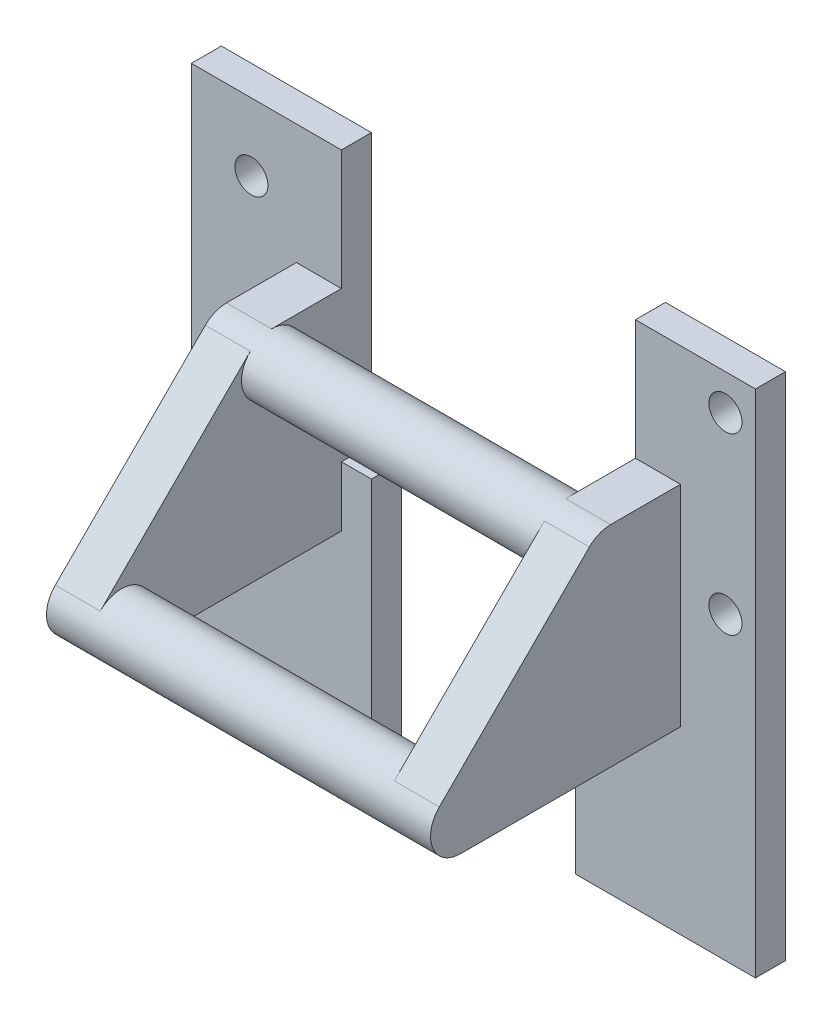
ISO-10303-21;
HEADER;
FILE_DESCRIPTION(('STEP AP214'),'2;1');
FILE_NAME('part.step','',(''),(''),'','','');
FILE_SCHEMA(('AUTOMOTIVE_DESIGN { 1 0 10303 214 1 1 1 1 }'));
ENDSEC;
DATA;
#1=APPLICATION_CONTEXT('core data for automotive mechanical design processes');
#2=APPLICATION_PROTOCOL_DEFINITION('international standard','automotive_design',2000,#1);
#3=PRODUCT_CONTEXT('',#1,'mechanical');
#4=PRODUCT('Part','Part','',(#3));
#5=PRODUCT_RELATED_PRODUCT_CATEGORY('part','',(#4));
#6=PRODUCT_DEFINITION_FORMATION('','',#4);
#7=PRODUCT_DEFINITION_CONTEXT('part definition',#1,'design');
#8=PRODUCT_DEFINITION('design','',#6,#7);
#9=PRODUCT_DEFINITION_SHAPE('','',#8);
#10=(LENGTH_UNIT() NAMED_UNIT(*) SI_UNIT(.MILLI.,.METRE.));
#11=(NAMED_UNIT(*) PLANE_ANGLE_UNIT() SI_UNIT($,.RADIAN.));
#12=(NAMED_UNIT(*) SI_UNIT($,.STERADIAN.) SOLID_ANGLE_UNIT());
#13=UNCERTAINTY_MEASURE_WITH_UNIT(LENGTH_MEASURE(1.E-05),#10,'distance_accuracy_value','');
#14=(GEOMETRIC_REPRESENTATION_CONTEXT(3) GLOBAL_UNCERTAINTY_ASSIGNED_CONTEXT((#13)) GLOBAL_UNIT_ASSIGNED_CONTEXT((#10,
#11,#12)) REPRESENTATION_CONTEXT('',''));
#15=CARTESIAN_POINT('',(0.,0.,0.));
#16=DIRECTION('',(0.,0.,1.));
#17=DIRECTION('',(1.,0.,0.));
#18=AXIS2_PLACEMENT_3D('',#15,#16,#17);
#19=CARTESIAN_POINT('',(0.,0.,5.));
#20=DIRECTION('',(0.,0.,1.));
#21=DIRECTION('',(1.,0.,0.));
#22=AXIS2_PLACEMENT_3D('',#19,#20,#21);
#23=PLANE('',#22);
#24=CARTESIAN_POINT('',(-64.,-65.,5.));
#25=DIRECTION('',(0.,0.,1.));
#26=DIRECTION('',(1.,0.,0.));
#27=AXIS2_PLACEMENT_3D('',#24,#25,#26);
#28=CIRCLE('',#27,2.75);
#29=CARTESIAN_POINT('',(-61.25,-65.,5.));
#30=VERTEX_POINT('',#29);
#31=EDGE_CURVE('E367',#30,#30,#28,.T.);
#32=ORIENTED_EDGE('',*,*,#31,.F.);
#33=EDGE_LOOP('',(#32));
#34=FACE_BOUND('',#33,.T.);
#35=CARTESIAN_POINT('',(-64.,-41.25,5.));
#36=DIRECTION('',(0.,0.,1.));
#37=DIRECTION('',(1.,0.,0.));
#38=AXIS2_PLACEMENT_3D('',#35,#36,#37);
#39=CIRCLE('',#38,2.75);
#40=CARTESIAN_POINT('',(-61.25,-41.25,5.));
#41=VERTEX_POINT('',#40);
#42=EDGE_CURVE('E361',#41,#41,#39,.T.);
#43=ORIENTED_EDGE('',*,*,#42,.F.);
#44=EDGE_LOOP('',(#43));
#45=FACE_BOUND('',#44,.T.);
#46=DIRECTION('',(0.,1.,0.));
#47=VECTOR('',#46,1.);
#48=CARTESIAN_POINT('',(-49.,-85.0000000000001,5.));
#49=LINE('',#48,#47);
#50=CARTESIAN_POINT('',(-49.,-85.0000000000001,5.));
#51=VERTEX_POINT('',#50);
#52=CARTESIAN_POINT('',(-49.,-75.,5.));
#53=VERTEX_POINT('',#52);
#54=EDGE_CURVE('E341',#51,#53,#49,.T.);
#55=ORIENTED_EDGE('',*,*,#54,.F.);
#56=DIRECTION('',(1.,0.,0.));
#57=VECTOR('',#56,1.);
#58=CARTESIAN_POINT('',(-56.5,-85.0000000000001,5.));
#59=LINE('',#58,#57);
#60=CARTESIAN_POINT('',(-56.5,-85.0000000000001,5.));
#61=VERTEX_POINT('',#60);
#62=EDGE_CURVE('E355',#61,#51,#59,.T.);
#63=ORIENTED_EDGE('',*,*,#62,.F.);
#64=DIRECTION('',(0.,1.,0.));
#65=VECTOR('',#64,1.);
#66=CARTESIAN_POINT('',(-56.5,0.,4.99999999999999));
#67=LINE('',#66,#65);
#68=CARTESIAN_POINT('',(-56.5,-50.,5.));
#69=VERTEX_POINT('',#68);
#70=EDGE_CURVE('E347',#61,#69,#67,.T.);
#71=ORIENTED_EDGE('',*,*,#70,.T.);
#72=DIRECTION('',(1.,0.,0.));
#73=VECTOR('',#72,1.);
#74=CARTESIAN_POINT('',(-56.5,-50.,5.));
#75=LINE('',#74,#73);
#76=CARTESIAN_POINT('',(-49.,-50.,5.));
#77=VERTEX_POINT('',#76);
#78=EDGE_CURVE('E356',#69,#77,#75,.T.);
#79=ORIENTED_EDGE('',*,*,#78,.T.);
#80=DIRECTION('',(0.,-1.,0.));
#81=VECTOR('',#80,1.);
#82=CARTESIAN_POINT('',(-49.,-30.,5.));
#83=LINE('',#82,#81);
#84=CARTESIAN_POINT('',(-49.,-30.,5.));
#85=VERTEX_POINT('',#84);
#86=EDGE_CURVE('E331',#85,#77,#83,.T.);
#87=ORIENTED_EDGE('',*,*,#86,.F.);
#88=DIRECTION('',(-1.,0.,0.));
#89=VECTOR('',#88,1.);
#90=CARTESIAN_POINT('',(-54.,-30.,5.));
#91=LINE('',#90,#89);
#92=CARTESIAN_POINT('',(-74.,-30.,5.));
#93=VERTEX_POINT('',#92);
#94=EDGE_CURVE('E373',#85,#93,#91,.T.);
#95=ORIENTED_EDGE('',*,*,#94,.T.);
#96=DIRECTION('',(0.,-1.,0.));
#97=VECTOR('',#96,1.);
#98=CARTESIAN_POINT('',(-74.,-30.,5.));
#99=LINE('',#98,#97);
#100=CARTESIAN_POINT('',(-74.0000000000001,-115.,5.));
#101=VERTEX_POINT('',#100);
#102=EDGE_CURVE('E376',#93,#101,#99,.T.);
#103=ORIENTED_EDGE('',*,*,#102,.T.);
#104=DIRECTION('',(1.,0.,0.));
#105=VECTOR('',#104,1.);
#106=CARTESIAN_POINT('',(-74.0000000000001,-115.,5.));
#107=LINE('',#106,#105);
#108=CARTESIAN_POINT('',(-44.,-115.,5.));
#109=VERTEX_POINT('',#108);
#110=EDGE_CURVE('E379',#101,#109,#107,.T.);
#111=ORIENTED_EDGE('',*,*,#110,.T.);
#112=DIRECTION('',(0.,1.,0.));
#113=VECTOR('',#112,1.);
#114=CARTESIAN_POINT('',(-44.,-115.,5.));
#115=LINE('',#114,#113);
#116=CARTESIAN_POINT('',(-44.,-75.,5.));
#117=VERTEX_POINT('',#116);
#118=EDGE_CURVE('E381',#109,#117,#115,.T.);
#119=ORIENTED_EDGE('',*,*,#118,.T.);
#120=DIRECTION('',(-1.,0.,0.));
#121=VECTOR('',#120,1.);
#122=CARTESIAN_POINT('',(-44.,-75.,5.));
#123=LINE('',#122,#121);
#124=EDGE_CURVE('E383',#117,#53,#123,.T.);
#125=ORIENTED_EDGE('',*,*,#124,.T.);
#126=EDGE_LOOP('',(#55,#63,#71,#79,#87,#95,#103,#111,#119,#125));
#127=FACE_BOUND('',#126,.T.);
#128=ADVANCED_FACE('F47',(#34,#45,#127),#23,.T.);
#129=CARTESIAN_POINT('',(0.,0.,0.));
#130=DIRECTION('',(0.,0.,1.));
#131=DIRECTION('',(1.,0.,0.));
#132=AXIS2_PLACEMENT_3D('',#129,#130,#131);
#133=PLANE('',#132);
#134=DIRECTION('',(-1.,0.,0.));
#135=VECTOR('',#134,1.);
#136=CARTESIAN_POINT('',(-54.,-30.,0.));
#137=LINE('',#136,#135);
#138=CARTESIAN_POINT('',(-49.,-30.,0.));
#139=VERTEX_POINT('',#138);
#140=CARTESIAN_POINT('',(-74.,-30.,0.));
#141=VERTEX_POINT('',#140);
#142=EDGE_CURVE('E370',#139,#141,#137,.T.);
#143=ORIENTED_EDGE('',*,*,#142,.F.);
#144=DIRECTION('',(0.,1.,0.));
#145=VECTOR('',#144,1.);
#146=CARTESIAN_POINT('',(-49.,-75.,0.));
#147=LINE('',#146,#145);
#148=CARTESIAN_POINT('',(-49.,-75.,0.));
#149=VERTEX_POINT('',#148);
#150=EDGE_CURVE('E325',#149,#139,#147,.T.);
#151=ORIENTED_EDGE('',*,*,#150,.F.);
#152=DIRECTION('',(-1.,0.,0.));
#153=VECTOR('',#152,1.);
#154=CARTESIAN_POINT('',(-44.,-75.,0.));
#155=LINE('',#154,#153);
#156=CARTESIAN_POINT('',(-44.,-75.,0.));
#157=VERTEX_POINT('',#156);
#158=EDGE_CURVE('E377',#157,#149,#155,.T.);
#159=ORIENTED_EDGE('',*,*,#158,.F.);
#160=DIRECTION('',(0.,1.,0.));
#161=VECTOR('',#160,1.);
#162=CARTESIAN_POINT('',(-44.,-115.,0.));
#163=LINE('',#162,#161);
#164=CARTESIAN_POINT('',(-44.,-115.,0.));
#165=VERTEX_POINT('',#164);
#166=EDGE_CURVE('E393',#165,#157,#163,.T.);
#167=ORIENTED_EDGE('',*,*,#166,.F.);
#168=DIRECTION('',(1.,0.,0.));
#169=VECTOR('',#168,1.);
#170=CARTESIAN_POINT('',(-74.0000000000001,-115.,0.));
#171=LINE('',#170,#169);
#172=CARTESIAN_POINT('',(-74.0000000000001,-115.,0.));
#173=VERTEX_POINT('',#172);
#174=EDGE_CURVE('E391',#173,#165,#171,.T.);
#175=ORIENTED_EDGE('',*,*,#174,.F.);
#176=DIRECTION('',(0.,-1.,0.));
#177=VECTOR('',#176,1.);
#178=CARTESIAN_POINT('',(-74.,-30.,0.));
#179=LINE('',#178,#177);
#180=EDGE_CURVE('E389',#141,#173,#179,.T.);
#181=ORIENTED_EDGE('',*,*,#180,.F.);
#182=EDGE_LOOP('',(#143,#151,#159,#167,#175,#181));
#183=FACE_BOUND('',#182,.T.);
#184=CARTESIAN_POINT('',(-64.,-65.,0.));
#185=DIRECTION('',(0.,0.,1.));
#186=DIRECTION('',(1.,0.,0.));
#187=AXIS2_PLACEMENT_3D('',#184,#185,#186);
#188=CIRCLE('',#187,2.75);
#189=CARTESIAN_POINT('',(-61.25,-65.,0.));
#190=VERTEX_POINT('',#189);
#191=EDGE_CURVE('E364',#190,#190,#188,.T.);
#192=ORIENTED_EDGE('',*,*,#191,.T.);
#193=EDGE_LOOP('',(#192));
#194=FACE_BOUND('',#193,.T.);
#195=CARTESIAN_POINT('',(-64.,-41.25,0.));
#196=DIRECTION('',(0.,0.,1.));
#197=DIRECTION('',(1.,0.,0.));
#198=AXIS2_PLACEMENT_3D('',#195,#196,#197);
#199=CIRCLE('',#198,2.75);
#200=CARTESIAN_POINT('',(-61.25,-41.25,0.));
#201=VERTEX_POINT('',#200);
#202=EDGE_CURVE('E358',#201,#201,#199,.T.);
#203=ORIENTED_EDGE('',*,*,#202,.T.);
#204=EDGE_LOOP('',(#203));
#205=FACE_BOUND('',#204,.T.);
#206=ADVANCED_FACE('F449',(#183,#194,#205),#133,.F.);
#207=CARTESIAN_POINT('',(-54.,-30.,5.));
#208=DIRECTION('',(0.,-1.,0.));
#209=DIRECTION('',(0.,0.,-1.));
#210=AXIS2_PLACEMENT_3D('',#207,#208,#209);
#211=PLANE('',#210);
#212=ORIENTED_EDGE('',*,*,#142,.T.);
#213=DIRECTION('',(0.,0.,-1.));
#214=VECTOR('',#213,1.);
#215=CARTESIAN_POINT('',(-74.,-30.,5.));
#216=LINE('',#215,#214);
#217=EDGE_CURVE('E404',#93,#141,#216,.T.);
#218=ORIENTED_EDGE('',*,*,#217,.F.);
#219=ORIENTED_EDGE('',*,*,#94,.F.);
#220=DIRECTION('',(0.,0.,1.));
#221=VECTOR('',#220,1.);
#222=CARTESIAN_POINT('',(-49.,-30.,0.));
#223=LINE('',#222,#221);
#224=EDGE_CURVE('E328',#139,#85,#223,.T.);
#225=ORIENTED_EDGE('',*,*,#224,.F.);
#226=EDGE_LOOP('',(#212,#218,#219,#225));
#227=FACE_BOUND('',#226,.T.);
#228=ADVANCED_FACE('F454',(#227),#211,.F.);
#229=CARTESIAN_POINT('',(-74.,-30.,5.));
#230=DIRECTION('',(1.,0.,0.));
#231=DIRECTION('',(0.,1.,0.));
#232=AXIS2_PLACEMENT_3D('',#229,#230,#231);
#233=PLANE('',#232);
#234=ORIENTED_EDGE('',*,*,#180,.T.);
#235=DIRECTION('',(0.,0.,-1.));
#236=VECTOR('',#235,1.);
#237=CARTESIAN_POINT('',(-74.0000000000001,-115.,5.));
#238=LINE('',#237,#236);
#239=EDGE_CURVE('E401',#101,#173,#238,.T.);
#240=ORIENTED_EDGE('',*,*,#239,.F.);
#241=ORIENTED_EDGE('',*,*,#102,.F.);
#242=ORIENTED_EDGE('',*,*,#217,.T.);
#243=EDGE_LOOP('',(#234,#240,#241,#242));
#244=FACE_BOUND('',#243,.T.);
#245=ADVANCED_FACE('F488',(#244),#233,.F.);
#246=CARTESIAN_POINT('',(-74.0000000000001,-115.,5.));
#247=DIRECTION('',(0.,1.,0.));
#248=DIRECTION('',(0.,0.,1.));
#249=AXIS2_PLACEMENT_3D('',#246,#247,#248);
#250=PLANE('',#249);
#251=ORIENTED_EDGE('',*,*,#174,.T.);
#252=DIRECTION('',(0.,0.,-1.));
#253=VECTOR('',#252,1.);
#254=CARTESIAN_POINT('',(-44.,-115.,5.));
#255=LINE('',#254,#253);
#256=EDGE_CURVE('E398',#109,#165,#255,.T.);
#257=ORIENTED_EDGE('',*,*,#256,.F.);
#258=ORIENTED_EDGE('',*,*,#110,.F.);
#259=ORIENTED_EDGE('',*,*,#239,.T.);
#260=EDGE_LOOP('',(#251,#257,#258,#259));
#261=FACE_BOUND('',#260,.T.);
#262=ADVANCED_FACE('F484',(#261),#250,.F.);
#263=CARTESIAN_POINT('',(-44.,-115.,5.));
#264=DIRECTION('',(-1.,0.,0.));
#265=DIRECTION('',(0.,0.,1.));
#266=AXIS2_PLACEMENT_3D('',#263,#264,#265);
#267=PLANE('',#266);
#268=ORIENTED_EDGE('',*,*,#166,.T.);
#269=DIRECTION('',(0.,0.,-1.));
#270=VECTOR('',#269,1.);
#271=CARTESIAN_POINT('',(-44.,-75.,5.));
#272=LINE('',#271,#270);
#273=EDGE_CURVE('E386',#117,#157,#272,.T.);
#274=ORIENTED_EDGE('',*,*,#273,.F.);
#275=ORIENTED_EDGE('',*,*,#118,.F.);
#276=ORIENTED_EDGE('',*,*,#256,.T.);
#277=EDGE_LOOP('',(#268,#274,#275,#276));
#278=FACE_BOUND('',#277,.T.);
#279=ADVANCED_FACE('F481',(#278),#267,.F.);
#280=CARTESIAN_POINT('',(-44.,-75.,5.));
#281=DIRECTION('',(0.,-1.,0.));
#282=DIRECTION('',(0.,0.,-1.));
#283=AXIS2_PLACEMENT_3D('',#280,#281,#282);
#284=PLANE('',#283);
#285=ORIENTED_EDGE('',*,*,#158,.T.);
#286=DIRECTION('',(0.,0.,-1.));
#287=VECTOR('',#286,1.);
#288=CARTESIAN_POINT('',(-49.,-75.,5.));
#289=LINE('',#288,#287);
#290=EDGE_CURVE('E322',#53,#149,#289,.T.);
#291=ORIENTED_EDGE('',*,*,#290,.F.);
#292=ORIENTED_EDGE('',*,*,#124,.F.);
#293=ORIENTED_EDGE('',*,*,#273,.T.);
#294=EDGE_LOOP('',(#285,#291,#292,#293));
#295=FACE_BOUND('',#294,.T.);
#296=ADVANCED_FACE('F444',(#295),#284,.F.);
#297=CARTESIAN_POINT('',(-64.,-65.,5.));
#298=DIRECTION('',(0.,0.,-1.));
#299=DIRECTION('',(-1.,0.,0.));
#300=AXIS2_PLACEMENT_3D('',#297,#298,#299);
#301=CYLINDRICAL_SURFACE('',#300,2.75);
#302=ORIENTED_EDGE('',*,*,#31,.T.);
#303=EDGE_LOOP('',(#302));
#304=FACE_BOUND('',#303,.T.);
#305=ORIENTED_EDGE('',*,*,#191,.F.);
#306=EDGE_LOOP('',(#305));
#307=FACE_BOUND('',#306,.T.);
#308=ADVANCED_FACE('F476',(#304,#307),#301,.F.);
#309=CARTESIAN_POINT('',(-64.,-41.25,5.));
#310=DIRECTION('',(0.,0.,-1.));
#311=DIRECTION('',(-1.,0.,0.));
#312=AXIS2_PLACEMENT_3D('',#309,#310,#311);
#313=CYLINDRICAL_SURFACE('',#312,2.75);
#314=ORIENTED_EDGE('',*,*,#42,.T.);
#315=EDGE_LOOP('',(#314));
#316=FACE_BOUND('',#315,.T.);
#317=ORIENTED_EDGE('',*,*,#202,.F.);
#318=EDGE_LOOP('',(#317));
#319=FACE_BOUND('',#318,.T.);
#320=ADVANCED_FACE('F654',(#316,#319),#313,.F.);
#321=CARTESIAN_POINT('',(-56.5,-85.0000000000001,0.));
#322=DIRECTION('',(0.,1.,0.));
#323=DIRECTION('',(0.,0.,1.));
#324=AXIS2_PLACEMENT_3D('',#321,#322,#323);
#325=PLANE('',#324);
#326=DIRECTION('',(0.,0.,-1.));
#327=VECTOR('',#326,1.);
#328=CARTESIAN_POINT('',(-49.,-85.0000000000001,53.7157287525383));
#329=LINE('',#328,#327);
#330=CARTESIAN_POINT('',(-49.,-85.0000000000001,41.6446609406728));
#331=VERTEX_POINT('',#330);
#332=EDGE_CURVE('E339',#331,#51,#329,.T.);
#333=ORIENTED_EDGE('',*,*,#332,.F.);
#334=DIRECTION('',(1.,0.,0.));
#335=VECTOR('',#334,1.);
#336=CARTESIAN_POINT('',(-56.5,-85.0000000000001,41.6446609406728));
#337=LINE('',#336,#335);
#338=CARTESIAN_POINT('',(-56.5,-85.0000000000001,41.6446609406728));
#339=VERTEX_POINT('',#338);
#340=EDGE_CURVE('E410',#331,#339,#337,.F.);
#341=ORIENTED_EDGE('',*,*,#340,.T.);
#342=DIRECTION('',(0.,0.,1.));
#343=VECTOR('',#342,1.);
#344=CARTESIAN_POINT('',(-56.5,-85.0000000000001,0.));
#345=LINE('',#344,#343);
#346=EDGE_CURVE('E344',#61,#339,#345,.T.);
#347=ORIENTED_EDGE('',*,*,#346,.F.);
#348=ORIENTED_EDGE('',*,*,#62,.T.);
#349=EDGE_LOOP('',(#333,#341,#347,#348));
#350=FACE_BOUND('',#349,.T.);
#351=ADVANCED_FACE('F435',(#350),#325,.F.);
#352=CARTESIAN_POINT('',(-56.5,-15.6421356237309,-15.6421356237309));
#353=DIRECTION('',(0.,0.707106781186547,0.707106781186548));
#354=DIRECTION('',(0.,-0.707106781186548,0.707106781186547));
#355=AXIS2_PLACEMENT_3D('',#352,#353,#354);
#356=PLANE('',#355);
#357=DIRECTION('',(0.,-0.707106781186548,0.707106781186547));
#358=VECTOR('',#357,1.);
#359=CARTESIAN_POINT('',(-49.,-50.,18.7157287525383));
#360=LINE('',#359,#358);
#361=CARTESIAN_POINT('',(-49.,-51.4644660940673,20.1801948466055));
#362=VERTEX_POINT('',#361);
#363=CARTESIAN_POINT('',(-49.,-76.4644660940673,45.1801948466056));
#364=VERTEX_POINT('',#363);
#365=EDGE_CURVE('E337',#362,#364,#360,.T.);
#366=ORIENTED_EDGE('',*,*,#365,.F.);
#367=DIRECTION('',(1.,0.,0.));
#368=VECTOR('',#367,1.);
#369=CARTESIAN_POINT('',(-56.5,-51.4644660940673,20.1801948466055));
#370=LINE('',#369,#368);
#371=CARTESIAN_POINT('',(-56.5,-51.4644660940673,20.1801948466055));
#372=VERTEX_POINT('',#371);
#373=EDGE_CURVE('E55',#362,#372,#370,.F.);
#374=ORIENTED_EDGE('',*,*,#373,.T.);
#375=DIRECTION('',(0.,-0.707106781186548,0.707106781186547));
#376=VECTOR('',#375,1.);
#377=CARTESIAN_POINT('',(-56.5,-15.6421356237309,-15.6421356237309));
#378=LINE('',#377,#376);
#379=CARTESIAN_POINT('',(-56.5,-76.4644660940673,45.1801948466056));
#380=VERTEX_POINT('',#379);
#381=EDGE_CURVE('E353',#372,#380,#378,.T.);
#382=ORIENTED_EDGE('',*,*,#381,.T.);
#383=DIRECTION('',(1.,0.,0.));
#384=VECTOR('',#383,1.);
#385=CARTESIAN_POINT('',(-49.,-76.4644660940673,45.1801948466056));
#386=LINE('',#385,#384);
#387=EDGE_CURVE('E407',#380,#364,#386,.T.);
#388=ORIENTED_EDGE('',*,*,#387,.T.);
#389=EDGE_LOOP('',(#366,#374,#382,#388));
#390=FACE_BOUND('',#389,.T.);
#391=ADVANCED_FACE('F427',(#390),#356,.T.);
#392=CARTESIAN_POINT('',(-56.5,-50.,0.));
#393=DIRECTION('',(0.,1.,0.));
#394=DIRECTION('',(0.,0.,1.));
#395=AXIS2_PLACEMENT_3D('',#392,#393,#394);
#396=PLANE('',#395);
#397=DIRECTION('',(0.,0.,1.));
#398=VECTOR('',#397,1.);
#399=CARTESIAN_POINT('',(-56.5,-50.,0.));
#400=LINE('',#399,#398);
#401=CARTESIAN_POINT('',(-56.5,-50.,16.6446609406728));
#402=VERTEX_POINT('',#401);
#403=EDGE_CURVE('E350',#69,#402,#400,.T.);
#404=ORIENTED_EDGE('',*,*,#403,.T.);
#405=DIRECTION('',(1.,0.,0.));
#406=VECTOR('',#405,1.);
#407=CARTESIAN_POINT('',(-56.5,-50.,16.6446609406728));
#408=LINE('',#407,#406);
#409=CARTESIAN_POINT('',(-49.,-50.,16.6446609406728));
#410=VERTEX_POINT('',#409);
#411=EDGE_CURVE('E415',#402,#410,#408,.T.);
#412=ORIENTED_EDGE('',*,*,#411,.T.);
#413=DIRECTION('',(0.,0.,1.));
#414=VECTOR('',#413,1.);
#415=CARTESIAN_POINT('',(-49.,-50.,5.));
#416=LINE('',#415,#414);
#417=EDGE_CURVE('E334',#77,#410,#416,.T.);
#418=ORIENTED_EDGE('',*,*,#417,.F.);
#419=ORIENTED_EDGE('',*,*,#78,.F.);
#420=EDGE_LOOP('',(#404,#412,#418,#419));
#421=FACE_BOUND('',#420,.T.);
#422=ADVANCED_FACE('F419',(#421),#396,.T.);
#423=CARTESIAN_POINT('',(-56.5,0.,0.));
#424=DIRECTION('',(1.,0.,0.));
#425=DIRECTION('',(0.,0.,-1.));
#426=AXIS2_PLACEMENT_3D('',#423,#424,#425);
#427=PLANE('',#426);
#428=ORIENTED_EDGE('',*,*,#381,.F.);
#429=CARTESIAN_POINT('',(-56.5,-55.,16.6446609406728));
#430=DIRECTION('',(1.,0.,0.));
#431=DIRECTION('',(0.,0.,-1.));
#432=AXIS2_PLACEMENT_3D('',#429,#430,#431);
#433=CIRCLE('',#432,5.);
#434=EDGE_CURVE('E13',#372,#402,#433,.F.);
#435=ORIENTED_EDGE('',*,*,#434,.T.);
#436=ORIENTED_EDGE('',*,*,#403,.F.);
#437=ORIENTED_EDGE('',*,*,#70,.F.);
#438=ORIENTED_EDGE('',*,*,#346,.T.);
#439=CARTESIAN_POINT('',(-56.5,-80.0000000000001,41.6446609406728));
#440=DIRECTION('',(1.,0.,0.));
#441=DIRECTION('',(0.,0.,-1.));
#442=AXIS2_PLACEMENT_3D('',#439,#440,#441);
#443=CIRCLE('',#442,5.);
#444=EDGE_CURVE('E412',#339,#380,#443,.F.);
#445=ORIENTED_EDGE('',*,*,#444,.T.);
#446=EDGE_LOOP('',(#428,#435,#436,#437,#438,#445));
#447=FACE_BOUND('',#446,.T.);
#448=ADVANCED_FACE('F456',(#447),#427,.F.);
#449=CARTESIAN_POINT('',(-49.,0.,0.));
#450=DIRECTION('',(1.,0.,0.));
#451=DIRECTION('',(0.,0.,-1.));
#452=AXIS2_PLACEMENT_3D('',#449,#450,#451);
#453=PLANE('',#452);
#454=ORIENTED_EDGE('',*,*,#417,.T.);
#455=CARTESIAN_POINT('',(-49.,-55.,16.6446609406728));
#456=DIRECTION('',(1.,0.,0.));
#457=DIRECTION('',(0.,0.,-1.));
#458=AXIS2_PLACEMENT_3D('',#455,#456,#457);
#459=CIRCLE('',#458,5.);
#460=EDGE_CURVE('E232',#362,#410,#459,.T.);
#461=ORIENTED_EDGE('',*,*,#460,.F.);
#462=ORIENTED_EDGE('',*,*,#365,.T.);
#463=CARTESIAN_POINT('',(-49.,-80.0000000000001,41.6446609406728));
#464=DIRECTION('',(1.,0.,0.));
#465=DIRECTION('',(0.,0.,-1.));
#466=AXIS2_PLACEMENT_3D('',#463,#464,#465);
#467=CIRCLE('',#466,5.00000000000001);
#468=EDGE_CURVE('E317',#331,#364,#467,.T.);
#469=ORIENTED_EDGE('',*,*,#468,.F.);
#470=ORIENTED_EDGE('',*,*,#332,.T.);
#471=ORIENTED_EDGE('',*,*,#54,.T.);
#472=ORIENTED_EDGE('',*,*,#290,.T.);
#473=ORIENTED_EDGE('',*,*,#150,.T.);
#474=ORIENTED_EDGE('',*,*,#224,.T.);
#475=ORIENTED_EDGE('',*,*,#86,.T.);
#476=EDGE_LOOP('',(#454,#461,#462,#469,#470,#471,#472,#473,#474,#475));
#477=FACE_BOUND('',#476,.T.);
#478=ADVANCED_FACE('F425',(#477),#453,.T.);
#479=CARTESIAN_POINT('',(-56.5,-80.0000000000001,41.6446609406728));
#480=DIRECTION('',(-1.,0.,0.));
#481=DIRECTION('',(0.,0.,1.));
#482=AXIS2_PLACEMENT_3D('',#479,#480,#481);
#483=CYLINDRICAL_SURFACE('',#482,5.);
#484=ORIENTED_EDGE('',*,*,#444,.F.);
#485=ORIENTED_EDGE('',*,*,#340,.F.);
#486=ORIENTED_EDGE('',*,*,#468,.T.);
#487=ORIENTED_EDGE('',*,*,#387,.F.);
#488=EDGE_LOOP('',(#484,#485,#486,#487));
#489=FACE_BOUND('',#488,.T.);
#490=CARTESIAN_POINT('',(0.,-80.0000000000001,41.6446609406728));
#491=DIRECTION('',(-1.,0.,0.));
#492=DIRECTION('',(0.,-1.,0.));
#493=AXIS2_PLACEMENT_3D('',#490,#491,#492);
#494=CIRCLE('',#493,5.00000000000001);
#495=CARTESIAN_POINT('',(0.,-76.4644660940673,45.1801948466056));
#496=VERTEX_POINT('',#495);
#497=CARTESIAN_POINT('',(0.,-85.0000000000001,41.6446609406728));
#498=VERTEX_POINT('',#497);
#499=EDGE_CURVE('E320',#496,#498,#494,.T.);
#500=ORIENTED_EDGE('',*,*,#499,.T.);
#501=DIRECTION('',(-1.,0.,0.));
#502=VECTOR('',#501,1.);
#503=CARTESIAN_POINT('',(7.5,-85.0000000000001,41.6446609406728));
#504=LINE('',#503,#502);
#505=CARTESIAN_POINT('',(7.5,-85.0000000000001,41.6446609406728));
#506=VERTEX_POINT('',#505);
#507=EDGE_CURVE('E310',#506,#498,#504,.T.);
#508=ORIENTED_EDGE('',*,*,#507,.F.);
#509=CARTESIAN_POINT('',(7.5,-80.0000000000001,41.6446609406728));
#510=DIRECTION('',(1.,0.,0.));
#511=DIRECTION('',(0.,0.,-1.));
#512=AXIS2_PLACEMENT_3D('',#509,#510,#511);
#513=CIRCLE('',#512,5.);
#514=CARTESIAN_POINT('',(7.5,-76.4644660940673,45.1801948466056));
#515=VERTEX_POINT('',#514);
#516=EDGE_CURVE('E313',#515,#506,#513,.T.);
#517=ORIENTED_EDGE('',*,*,#516,.F.);
#518=DIRECTION('',(-1.,0.,0.));
#519=VECTOR('',#518,1.);
#520=CARTESIAN_POINT('',(7.5,-76.4644660940673,45.1801948466056));
#521=LINE('',#520,#519);
#522=EDGE_CURVE('E62',#496,#515,#521,.F.);
#523=ORIENTED_EDGE('',*,*,#522,.F.);
#524=EDGE_LOOP('',(#500,#508,#517,#523));
#525=FACE_BOUND('',#524,.T.);
#526=ADVANCED_FACE('F433',(#489,#525),#483,.T.);
#527=CARTESIAN_POINT('',(-56.5,-55.,16.6446609406728));
#528=DIRECTION('',(1.,0.,0.));
#529=DIRECTION('',(0.,0.,-1.));
#530=AXIS2_PLACEMENT_3D('',#527,#528,#529);
#531=CYLINDRICAL_SURFACE('',#530,5.);
#532=ORIENTED_EDGE('',*,*,#434,.F.);
#533=ORIENTED_EDGE('',*,*,#373,.F.);
#534=ORIENTED_EDGE('',*,*,#460,.T.);
#535=ORIENTED_EDGE('',*,*,#411,.F.);
#536=EDGE_LOOP('',(#532,#533,#534,#535));
#537=FACE_BOUND('',#536,.T.);
#538=CARTESIAN_POINT('',(7.5,-55.,16.6446609406728));
#539=DIRECTION('',(1.,0.,0.));
#540=DIRECTION('',(0.,0.,-1.));
#541=AXIS2_PLACEMENT_3D('',#538,#539,#540);
#542=CIRCLE('',#541,5.);
#543=CARTESIAN_POINT('',(7.5,-50.,16.6446609406728));
#544=VERTEX_POINT('',#543);
#545=CARTESIAN_POINT('',(7.5,-51.4644660940673,20.1801948466055));
#546=VERTEX_POINT('',#545);
#547=EDGE_CURVE('E212',#544,#546,#542,.T.);
#548=ORIENTED_EDGE('',*,*,#547,.F.);
#549=DIRECTION('',(-1.,0.,0.));
#550=VECTOR('',#549,1.);
#551=CARTESIAN_POINT('',(7.5,-50.,16.6446609406728));
#552=LINE('',#551,#550);
#553=CARTESIAN_POINT('',(0.,-50.,16.6446609406728));
#554=VERTEX_POINT('',#553);
#555=EDGE_CURVE('E207',#554,#544,#552,.F.);
#556=ORIENTED_EDGE('',*,*,#555,.F.);
#557=CARTESIAN_POINT('',(0.,-55.,16.6446609406728));
#558=DIRECTION('',(-1.,0.,0.));
#559=DIRECTION('',(0.,-1.,0.));
#560=AXIS2_PLACEMENT_3D('',#557,#558,#559);
#561=CIRCLE('',#560,5.);
#562=CARTESIAN_POINT('',(0.,-51.4644660940673,20.1801948466055));
#563=VERTEX_POINT('',#562);
#564=EDGE_CURVE('E211',#554,#563,#561,.T.);
#565=ORIENTED_EDGE('',*,*,#564,.T.);
#566=DIRECTION('',(-1.,0.,0.));
#567=VECTOR('',#566,1.);
#568=CARTESIAN_POINT('',(7.5,-51.4644660940673,20.1801948466055));
#569=LINE('',#568,#567);
#570=EDGE_CURVE('E215',#546,#563,#569,.T.);
#571=ORIENTED_EDGE('',*,*,#570,.F.);
#572=EDGE_LOOP('',(#548,#556,#565,#571));
#573=FACE_BOUND('',#572,.T.);
#574=ADVANCED_FACE('F49',(#537,#573),#531,.T.);
#575=CARTESIAN_POINT('',(0.,0.,5.));
#576=DIRECTION('',(0.,0.,1.));
#577=DIRECTION('',(1.,0.,0.));
#578=AXIS2_PLACEMENT_3D('',#575,#576,#577);
#579=PLANE('',#578);
#580=CARTESIAN_POINT('',(15.,-35.9197134027332,5.));
#581=DIRECTION('',(0.,0.,1.));
#582=DIRECTION('',(1.,0.,0.));
#583=AXIS2_PLACEMENT_3D('',#580,#581,#582);
#584=CIRCLE('',#583,2.75);
#585=CARTESIAN_POINT('',(17.75,-35.9197134027332,5.));
#586=VERTEX_POINT('',#585);
#587=EDGE_CURVE('E273',#586,#586,#584,.T.);
#588=ORIENTED_EDGE('',*,*,#587,.F.);
#589=EDGE_LOOP('',(#588));
#590=FACE_BOUND('',#589,.T.);
#591=CARTESIAN_POINT('',(15.,-65.,5.));
#592=DIRECTION('',(0.,0.,1.));
#593=DIRECTION('',(1.,0.,0.));
#594=AXIS2_PLACEMENT_3D('',#591,#592,#593);
#595=CIRCLE('',#594,2.75);
#596=CARTESIAN_POINT('',(17.75,-65.,5.));
#597=VERTEX_POINT('',#596);
#598=EDGE_CURVE('E267',#597,#597,#595,.T.);
#599=ORIENTED_EDGE('',*,*,#598,.F.);
#600=EDGE_LOOP('',(#599));
#601=FACE_BOUND('',#600,.T.);
#602=DIRECTION('',(-1.,0.,0.));
#603=VECTOR('',#602,1.);
#604=CARTESIAN_POINT('',(7.5,-85.0000000000001,5.));
#605=LINE('',#604,#603);
#606=CARTESIAN_POINT('',(7.5,-85.0000000000001,5.));
#607=VERTEX_POINT('',#606);
#608=CARTESIAN_POINT('',(0.,-85.0000000000001,5.));
#609=VERTEX_POINT('',#608);
#610=EDGE_CURVE('E263',#607,#609,#605,.T.);
#611=ORIENTED_EDGE('',*,*,#610,.T.);
#612=DIRECTION('',(0.,-1.,0.));
#613=VECTOR('',#612,1.);
#614=CARTESIAN_POINT('',(0.,-75.,5.));
#615=LINE('',#614,#613);
#616=CARTESIAN_POINT('',(0.,-75.,5.));
#617=VERTEX_POINT('',#616);
#618=EDGE_CURVE('E245',#617,#609,#615,.T.);
#619=ORIENTED_EDGE('',*,*,#618,.F.);
#620=DIRECTION('',(-1.,0.,0.));
#621=VECTOR('',#620,1.);
#622=CARTESIAN_POINT('',(5.,-75.,5.));
#623=LINE('',#622,#621);
#624=CARTESIAN_POINT('',(-9.99999999999999,-75.0000000000001,5.));
#625=VERTEX_POINT('',#624);
#626=EDGE_CURVE('E279',#617,#625,#623,.T.);
#627=ORIENTED_EDGE('',*,*,#626,.T.);
#628=DIRECTION('',(0.,-1.,0.));
#629=VECTOR('',#628,1.);
#630=CARTESIAN_POINT('',(-9.99999999999999,-75.0000000000001,5.));
#631=LINE('',#630,#629);
#632=CARTESIAN_POINT('',(-9.99999999999999,-115.,5.));
#633=VERTEX_POINT('',#632);
#634=EDGE_CURVE('E281',#625,#633,#631,.T.);
#635=ORIENTED_EDGE('',*,*,#634,.T.);
#636=DIRECTION('',(1.,0.,0.));
#637=VECTOR('',#636,1.);
#638=CARTESIAN_POINT('',(-9.99999999999999,-115.,5.));
#639=LINE('',#638,#637);
#640=CARTESIAN_POINT('',(20.,-115.,5.));
#641=VERTEX_POINT('',#640);
#642=EDGE_CURVE('E284',#633,#641,#639,.T.);
#643=ORIENTED_EDGE('',*,*,#642,.T.);
#644=DIRECTION('',(0.,1.,0.));
#645=VECTOR('',#644,1.);
#646=CARTESIAN_POINT('',(20.,-115.,5.));
#647=LINE('',#646,#645);
#648=CARTESIAN_POINT('',(20.,-30.,5.));
#649=VERTEX_POINT('',#648);
#650=EDGE_CURVE('E286',#641,#649,#647,.T.);
#651=ORIENTED_EDGE('',*,*,#650,.T.);
#652=DIRECTION('',(-1.,0.,0.));
#653=VECTOR('',#652,1.);
#654=CARTESIAN_POINT('',(20.,-30.,5.));
#655=LINE('',#654,#653);
#656=CARTESIAN_POINT('',(0.,-30.,5.));
#657=VERTEX_POINT('',#656);
#658=EDGE_CURVE('E288',#649,#657,#655,.T.);
#659=ORIENTED_EDGE('',*,*,#658,.T.);
#660=DIRECTION('',(0.,1.,0.));
#661=VECTOR('',#660,1.);
#662=CARTESIAN_POINT('',(0.,-50.,5.));
#663=LINE('',#662,#661);
#664=CARTESIAN_POINT('',(0.,-50.,5.));
#665=VERTEX_POINT('',#664);
#666=EDGE_CURVE('E225',#665,#657,#663,.T.);
#667=ORIENTED_EDGE('',*,*,#666,.F.);
#668=DIRECTION('',(-1.,0.,0.));
#669=VECTOR('',#668,1.);
#670=CARTESIAN_POINT('',(7.5,-50.,5.));
#671=LINE('',#670,#669);
#672=CARTESIAN_POINT('',(7.5,-50.,5.));
#673=VERTEX_POINT('',#672);
#674=EDGE_CURVE('E221',#673,#665,#671,.T.);
#675=ORIENTED_EDGE('',*,*,#674,.F.);
#676=DIRECTION('',(0.,-1.,0.));
#677=VECTOR('',#676,1.);
#678=CARTESIAN_POINT('',(7.5,-75.,5.));
#679=LINE('',#678,#677);
#680=EDGE_CURVE('E253',#673,#607,#679,.T.);
#681=ORIENTED_EDGE('',*,*,#680,.T.);
#682=EDGE_LOOP('',(#611,#619,#627,#635,#643,#651,#659,#667,#675,#681));
#683=FACE_BOUND('',#682,.T.);
#684=ADVANCED_FACE('F498',(#590,#601,#683),#579,.T.);
#685=CARTESIAN_POINT('',(0.,0.,0.));
#686=DIRECTION('',(0.,0.,1.));
#687=DIRECTION('',(1.,0.,0.));
#688=AXIS2_PLACEMENT_3D('',#685,#686,#687);
#689=PLANE('',#688);
#690=DIRECTION('',(-1.,0.,0.));
#691=VECTOR('',#690,1.);
#692=CARTESIAN_POINT('',(5.,-75.,0.));
#693=LINE('',#692,#691);
#694=CARTESIAN_POINT('',(0.,-75.,0.));
#695=VERTEX_POINT('',#694);
#696=CARTESIAN_POINT('',(-9.99999999999999,-75.0000000000001,0.));
#697=VERTEX_POINT('',#696);
#698=EDGE_CURVE('E276',#695,#697,#693,.T.);
#699=ORIENTED_EDGE('',*,*,#698,.F.);
#700=DIRECTION('',(0.,-1.,0.));
#701=VECTOR('',#700,1.);
#702=CARTESIAN_POINT('',(0.,-30.,0.));
#703=LINE('',#702,#701);
#704=CARTESIAN_POINT('',(0.,-30.,0.));
#705=VERTEX_POINT('',#704);
#706=EDGE_CURVE('E235',#705,#695,#703,.T.);
#707=ORIENTED_EDGE('',*,*,#706,.F.);
#708=DIRECTION('',(-1.,0.,0.));
#709=VECTOR('',#708,1.);
#710=CARTESIAN_POINT('',(20.,-30.,0.));
#711=LINE('',#710,#709);
#712=CARTESIAN_POINT('',(20.,-30.,0.));
#713=VERTEX_POINT('',#712);
#714=EDGE_CURVE('E282',#713,#705,#711,.T.);
#715=ORIENTED_EDGE('',*,*,#714,.F.);
#716=DIRECTION('',(0.,1.,0.));
#717=VECTOR('',#716,1.);
#718=CARTESIAN_POINT('',(20.,-115.,0.));
#719=LINE('',#718,#717);
#720=CARTESIAN_POINT('',(20.,-115.,0.));
#721=VERTEX_POINT('',#720);
#722=EDGE_CURVE('E296',#721,#713,#719,.T.);
#723=ORIENTED_EDGE('',*,*,#722,.F.);
#724=DIRECTION('',(1.,0.,0.));
#725=VECTOR('',#724,1.);
#726=CARTESIAN_POINT('',(-9.99999999999999,-115.,0.));
#727=LINE('',#726,#725);
#728=CARTESIAN_POINT('',(-9.99999999999999,-115.,0.));
#729=VERTEX_POINT('',#728);
#730=EDGE_CURVE('E294',#729,#721,#727,.T.);
#731=ORIENTED_EDGE('',*,*,#730,.F.);
#732=DIRECTION('',(0.,-1.,0.));
#733=VECTOR('',#732,1.);
#734=CARTESIAN_POINT('',(-9.99999999999999,-75.0000000000001,0.));
#735=LINE('',#734,#733);
#736=EDGE_CURVE('E292',#697,#729,#735,.T.);
#737=ORIENTED_EDGE('',*,*,#736,.F.);
#738=EDGE_LOOP('',(#699,#707,#715,#723,#731,#737));
#739=FACE_BOUND('',#738,.T.);
#740=CARTESIAN_POINT('',(15.,-35.9197134027332,0.));
#741=DIRECTION('',(0.,0.,1.));
#742=DIRECTION('',(1.,0.,0.));
#743=AXIS2_PLACEMENT_3D('',#740,#741,#742);
#744=CIRCLE('',#743,2.75);
#745=CARTESIAN_POINT('',(17.75,-35.9197134027332,0.));
#746=VERTEX_POINT('',#745);
#747=EDGE_CURVE('E270',#746,#746,#744,.T.);
#748=ORIENTED_EDGE('',*,*,#747,.T.);
#749=EDGE_LOOP('',(#748));
#750=FACE_BOUND('',#749,.T.);
#751=CARTESIAN_POINT('',(15.,-65.,0.));
#752=DIRECTION('',(0.,0.,1.));
#753=DIRECTION('',(1.,0.,0.));
#754=AXIS2_PLACEMENT_3D('',#751,#752,#753);
#755=CIRCLE('',#754,2.75);
#756=CARTESIAN_POINT('',(17.75,-65.,0.));
#757=VERTEX_POINT('',#756);
#758=EDGE_CURVE('E265',#757,#757,#755,.T.);
#759=ORIENTED_EDGE('',*,*,#758,.T.);
#760=EDGE_LOOP('',(#759));
#761=FACE_BOUND('',#760,.T.);
#762=ADVANCED_FACE('F502',(#739,#750,#761),#689,.F.);
#763=CARTESIAN_POINT('',(5.,-75.,5.));
#764=DIRECTION('',(0.,-1.,0.));
#765=DIRECTION('',(1.,0.,0.));
#766=AXIS2_PLACEMENT_3D('',#763,#764,#765);
#767=PLANE('',#766);
#768=ORIENTED_EDGE('',*,*,#626,.F.);
#769=DIRECTION('',(0.,0.,1.));
#770=VECTOR('',#769,1.);
#771=CARTESIAN_POINT('',(0.,-75.,0.));
#772=LINE('',#771,#770);
#773=EDGE_CURVE('E242',#695,#617,#772,.T.);
#774=ORIENTED_EDGE('',*,*,#773,.F.);
#775=ORIENTED_EDGE('',*,*,#698,.T.);
#776=DIRECTION('',(0.,0.,-1.));
#777=VECTOR('',#776,1.);
#778=CARTESIAN_POINT('',(-9.99999999999999,-75.0000000000001,5.));
#779=LINE('',#778,#777);
#780=EDGE_CURVE('E307',#625,#697,#779,.T.);
#781=ORIENTED_EDGE('',*,*,#780,.F.);
#782=EDGE_LOOP('',(#768,#774,#775,#781));
#783=FACE_BOUND('',#782,.T.);
#784=ADVANCED_FACE('F508',(#783),#767,.F.);
#785=CARTESIAN_POINT('',(-9.99999999999999,-75.0000000000001,5.));
#786=DIRECTION('',(1.,0.,0.));
#787=DIRECTION('',(0.,0.,-1.));
#788=AXIS2_PLACEMENT_3D('',#785,#786,#787);
#789=PLANE('',#788);
#790=ORIENTED_EDGE('',*,*,#736,.T.);
#791=DIRECTION('',(0.,0.,-1.));
#792=VECTOR('',#791,1.);
#793=CARTESIAN_POINT('',(-9.99999999999999,-115.,5.));
#794=LINE('',#793,#792);
#795=EDGE_CURVE('E304',#633,#729,#794,.T.);
#796=ORIENTED_EDGE('',*,*,#795,.F.);
#797=ORIENTED_EDGE('',*,*,#634,.F.);
#798=ORIENTED_EDGE('',*,*,#780,.T.);
#799=EDGE_LOOP('',(#790,#796,#797,#798));
#800=FACE_BOUND('',#799,.T.);
#801=ADVANCED_FACE('F528',(#800),#789,.F.);
#802=CARTESIAN_POINT('',(-9.99999999999999,-115.,5.));
#803=DIRECTION('',(0.,1.,0.));
#804=DIRECTION('',(0.,0.,1.));
#805=AXIS2_PLACEMENT_3D('',#802,#803,#804);
#806=PLANE('',#805);
#807=ORIENTED_EDGE('',*,*,#730,.T.);
#808=DIRECTION('',(0.,0.,-1.));
#809=VECTOR('',#808,1.);
#810=CARTESIAN_POINT('',(20.,-115.,5.));
#811=LINE('',#810,#809);
#812=EDGE_CURVE('E301',#641,#721,#811,.T.);
#813=ORIENTED_EDGE('',*,*,#812,.F.);
#814=ORIENTED_EDGE('',*,*,#642,.F.);
#815=ORIENTED_EDGE('',*,*,#795,.T.);
#816=EDGE_LOOP('',(#807,#813,#814,#815));
#817=FACE_BOUND('',#816,.T.);
#818=ADVANCED_FACE('F524',(#817),#806,.F.);
#819=CARTESIAN_POINT('',(20.,-115.,5.));
#820=DIRECTION('',(-1.,0.,0.));
#821=DIRECTION('',(0.,-1.,0.));
#822=AXIS2_PLACEMENT_3D('',#819,#820,#821);
#823=PLANE('',#822);
#824=ORIENTED_EDGE('',*,*,#722,.T.);
#825=DIRECTION('',(0.,0.,-1.));
#826=VECTOR('',#825,1.);
#827=CARTESIAN_POINT('',(20.,-30.,5.));
#828=LINE('',#827,#826);
#829=EDGE_CURVE('E290',#649,#713,#828,.T.);
#830=ORIENTED_EDGE('',*,*,#829,.F.);
#831=ORIENTED_EDGE('',*,*,#650,.F.);
#832=ORIENTED_EDGE('',*,*,#812,.T.);
#833=EDGE_LOOP('',(#824,#830,#831,#832));
#834=FACE_BOUND('',#833,.T.);
#835=ADVANCED_FACE('F520',(#834),#823,.F.);
#836=CARTESIAN_POINT('',(20.,-30.,5.));
#837=DIRECTION('',(0.,-1.,0.));
#838=DIRECTION('',(0.,0.,-1.));
#839=AXIS2_PLACEMENT_3D('',#836,#837,#838);
#840=PLANE('',#839);
#841=ORIENTED_EDGE('',*,*,#714,.T.);
#842=DIRECTION('',(0.,0.,-1.));
#843=VECTOR('',#842,1.);
#844=CARTESIAN_POINT('',(0.,-30.,5.));
#845=LINE('',#844,#843);
#846=EDGE_CURVE('E231',#657,#705,#845,.T.);
#847=ORIENTED_EDGE('',*,*,#846,.F.);
#848=ORIENTED_EDGE('',*,*,#658,.F.);
#849=ORIENTED_EDGE('',*,*,#829,.T.);
#850=EDGE_LOOP('',(#841,#847,#848,#849));
#851=FACE_BOUND('',#850,.T.);
#852=ADVANCED_FACE('F517',(#851),#840,.F.);
#853=CARTESIAN_POINT('',(15.,-35.9197134027332,5.));
#854=DIRECTION('',(0.,0.,-1.));
#855=DIRECTION('',(-1.,0.,0.));
#856=AXIS2_PLACEMENT_3D('',#853,#854,#855);
#857=CYLINDRICAL_SURFACE('',#856,2.75);
#858=ORIENTED_EDGE('',*,*,#587,.T.);
#859=EDGE_LOOP('',(#858));
#860=FACE_BOUND('',#859,.T.);
#861=ORIENTED_EDGE('',*,*,#747,.F.);
#862=EDGE_LOOP('',(#861));
#863=FACE_BOUND('',#862,.T.);
#864=ADVANCED_FACE('F514',(#860,#863),#857,.F.);
#865=CARTESIAN_POINT('',(15.,-65.,5.));
#866=DIRECTION('',(0.,0.,-1.));
#867=DIRECTION('',(-1.,0.,0.));
#868=AXIS2_PLACEMENT_3D('',#865,#866,#867);
#869=CYLINDRICAL_SURFACE('',#868,2.75);
#870=ORIENTED_EDGE('',*,*,#598,.T.);
#871=EDGE_LOOP('',(#870));
#872=FACE_BOUND('',#871,.T.);
#873=ORIENTED_EDGE('',*,*,#758,.F.);
#874=EDGE_LOOP('',(#873));
#875=FACE_BOUND('',#874,.T.);
#876=ADVANCED_FACE('F574',(#872,#875),#869,.F.);
#877=CARTESIAN_POINT('',(7.5,-50.,18.7157287525383));
#878=DIRECTION('',(0.,1.,0.));
#879=DIRECTION('',(0.,0.,1.));
#880=AXIS2_PLACEMENT_3D('',#877,#878,#879);
#881=PLANE('',#880);
#882=DIRECTION('',(0.,0.,-1.));
#883=VECTOR('',#882,1.);
#884=CARTESIAN_POINT('',(0.,-50.,18.7157287525383));
#885=LINE('',#884,#883);
#886=EDGE_CURVE('E218',#554,#665,#885,.T.);
#887=ORIENTED_EDGE('',*,*,#886,.F.);
#888=ORIENTED_EDGE('',*,*,#555,.T.);
#889=DIRECTION('',(0.,0.,-1.));
#890=VECTOR('',#889,1.);
#891=CARTESIAN_POINT('',(7.5,-50.,18.7157287525383));
#892=LINE('',#891,#890);
#893=EDGE_CURVE('E261',#544,#673,#892,.T.);
#894=ORIENTED_EDGE('',*,*,#893,.T.);
#895=ORIENTED_EDGE('',*,*,#674,.T.);
#896=EDGE_LOOP('',(#887,#888,#894,#895));
#897=FACE_BOUND('',#896,.T.);
#898=ADVANCED_FACE('F219',(#897),#881,.T.);
#899=CARTESIAN_POINT('',(7.5,-85.0000000000001,53.7157287525383));
#900=DIRECTION('',(0.,0.707106781186547,0.707106781186548));
#901=DIRECTION('',(0.,-0.707106781186548,0.707106781186547));
#902=AXIS2_PLACEMENT_3D('',#899,#900,#901);
#903=PLANE('',#902);
#904=DIRECTION('',(0.,0.707106781186548,-0.707106781186547));
#905=VECTOR('',#904,1.);
#906=CARTESIAN_POINT('',(7.5,-85.0000000000001,53.7157287525383));
#907=LINE('',#906,#905);
#908=EDGE_CURVE('E258',#515,#546,#907,.T.);
#909=ORIENTED_EDGE('',*,*,#908,.T.);
#910=ORIENTED_EDGE('',*,*,#570,.T.);
#911=DIRECTION('',(0.,0.707106781186548,-0.707106781186547));
#912=VECTOR('',#911,1.);
#913=CARTESIAN_POINT('',(0.,-85.0000000000001,53.7157287525383));
#914=LINE('',#913,#912);
#915=EDGE_CURVE('E226',#496,#563,#914,.T.);
#916=ORIENTED_EDGE('',*,*,#915,.F.);
#917=ORIENTED_EDGE('',*,*,#522,.T.);
#918=EDGE_LOOP('',(#909,#910,#916,#917));
#919=FACE_BOUND('',#918,.T.);
#920=ADVANCED_FACE('F566',(#919),#903,.T.);
#921=CARTESIAN_POINT('',(7.5,-85.0000000000001,5.));
#922=DIRECTION('',(0.,-1.,0.));
#923=DIRECTION('',(1.,0.,0.));
#924=AXIS2_PLACEMENT_3D('',#921,#922,#923);
#925=PLANE('',#924);
#926=DIRECTION('',(0.,0.,1.));
#927=VECTOR('',#926,1.);
#928=CARTESIAN_POINT('',(7.5,-85.0000000000001,5.));
#929=LINE('',#928,#927);
#930=EDGE_CURVE('E255',#607,#506,#929,.T.);
#931=ORIENTED_EDGE('',*,*,#930,.T.);
#932=ORIENTED_EDGE('',*,*,#507,.T.);
#933=DIRECTION('',(0.,0.,1.));
#934=VECTOR('',#933,1.);
#935=CARTESIAN_POINT('',(0.,-85.0000000000001,5.));
#936=LINE('',#935,#934);
#937=EDGE_CURVE('E248',#609,#498,#936,.T.);
#938=ORIENTED_EDGE('',*,*,#937,.F.);
#939=ORIENTED_EDGE('',*,*,#610,.F.);
#940=EDGE_LOOP('',(#931,#932,#938,#939));
#941=FACE_BOUND('',#940,.T.);
#942=ADVANCED_FACE('F561',(#941),#925,.T.);
#943=CARTESIAN_POINT('',(7.5,0.,0.));
#944=DIRECTION('',(1.,0.,0.));
#945=DIRECTION('',(0.,0.,-1.));
#946=AXIS2_PLACEMENT_3D('',#943,#944,#945);
#947=PLANE('',#946);
#948=ORIENTED_EDGE('',*,*,#893,.F.);
#949=ORIENTED_EDGE('',*,*,#547,.T.);
#950=ORIENTED_EDGE('',*,*,#908,.F.);
#951=ORIENTED_EDGE('',*,*,#516,.T.);
#952=ORIENTED_EDGE('',*,*,#930,.F.);
#953=ORIENTED_EDGE('',*,*,#680,.F.);
#954=EDGE_LOOP('',(#948,#949,#950,#951,#952,#953));
#955=FACE_BOUND('',#954,.T.);
#956=ADVANCED_FACE('F563',(#955),#947,.T.);
#957=CARTESIAN_POINT('',(0.,0.,0.));
#958=DIRECTION('',(-1.,0.,0.));
#959=DIRECTION('',(0.,-1.,0.));
#960=AXIS2_PLACEMENT_3D('',#957,#958,#959);
#961=PLANE('',#960);
#962=ORIENTED_EDGE('',*,*,#915,.T.);
#963=ORIENTED_EDGE('',*,*,#564,.F.);
#964=ORIENTED_EDGE('',*,*,#886,.T.);
#965=ORIENTED_EDGE('',*,*,#666,.T.);
#966=ORIENTED_EDGE('',*,*,#846,.T.);
#967=ORIENTED_EDGE('',*,*,#706,.T.);
#968=ORIENTED_EDGE('',*,*,#773,.T.);
#969=ORIENTED_EDGE('',*,*,#618,.T.);
#970=ORIENTED_EDGE('',*,*,#937,.T.);
#971=ORIENTED_EDGE('',*,*,#499,.F.);
#972=EDGE_LOOP('',(#962,#963,#964,#965,#966,#967,#968,#969,#970,#971));
#973=FACE_BOUND('',#972,.T.);
#974=ADVANCED_FACE('F229',(#973),#961,.T.);
#975=CLOSED_SHELL('',(#128,#206,#228,#245,#262,#279,#296,#308,#320,#351,#391,#422,#448,#478,
#526,#574,#684,#762,#784,#801,#818,#835,#852,#864,#876,#898,#920,#942,#956,#974));
#976=MANIFOLD_SOLID_BREP('B2',#975);
#977=ADVANCED_BREP_SHAPE_REPRESENTATION('',(#18,#976),#14);
#978=SHAPE_DEFINITION_REPRESENTATION(#9,#977);
ENDSEC;
END-ISO-10303-21;
